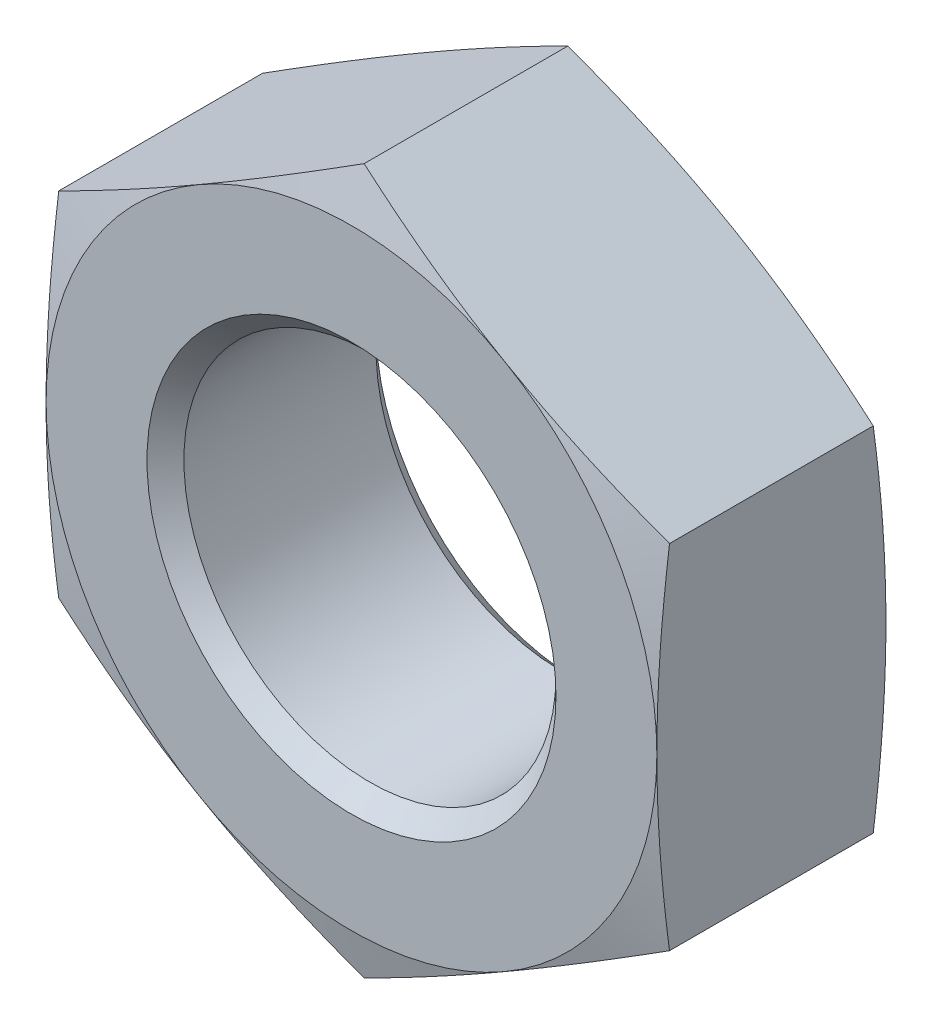
ISO-10303-21;
HEADER;
FILE_DESCRIPTION(('STEP AP214'),'2;1');
FILE_NAME('part.step','',(''),(''),'','','');
FILE_SCHEMA(('AUTOMOTIVE_DESIGN { 1 0 10303 214 1 1 1 1 }'));
ENDSEC;
DATA;
#1=APPLICATION_CONTEXT('core data for automotive mechanical design processes');
#2=APPLICATION_PROTOCOL_DEFINITION('international standard','automotive_design',2000,#1);
#3=PRODUCT_CONTEXT('',#1,'mechanical');
#4=PRODUCT('Part','Part','',(#3));
#5=PRODUCT_RELATED_PRODUCT_CATEGORY('part','',(#4));
#6=PRODUCT_DEFINITION_FORMATION('','',#4);
#7=PRODUCT_DEFINITION_CONTEXT('part definition',#1,'design');
#8=PRODUCT_DEFINITION('design','',#6,#7);
#9=PRODUCT_DEFINITION_SHAPE('','',#8);
#10=(LENGTH_UNIT() NAMED_UNIT(*) SI_UNIT(.MILLI.,.METRE.));
#11=(NAMED_UNIT(*) PLANE_ANGLE_UNIT() SI_UNIT($,.RADIAN.));
#12=(NAMED_UNIT(*) SI_UNIT($,.STERADIAN.) SOLID_ANGLE_UNIT());
#13=UNCERTAINTY_MEASURE_WITH_UNIT(LENGTH_MEASURE(1.E-05),#10,'distance_accuracy_value','');
#14=(GEOMETRIC_REPRESENTATION_CONTEXT(3) GLOBAL_UNCERTAINTY_ASSIGNED_CONTEXT((#13)) GLOBAL_UNIT_ASSIGNED_CONTEXT((#10,
#11,#12)) REPRESENTATION_CONTEXT('',''));
#15=CARTESIAN_POINT('',(0.,0.,0.));
#16=DIRECTION('',(0.,0.,1.));
#17=DIRECTION('',(1.,0.,0.));
#18=AXIS2_PLACEMENT_3D('',#15,#16,#17);
#19=CARTESIAN_POINT('',(0.,0.,0.));
#20=DIRECTION('',(0.,0.,-1.));
#21=DIRECTION('',(-1.,0.,0.));
#22=AXIS2_PLACEMENT_3D('',#19,#20,#21);
#23=PLANE('',#22);
#24=CARTESIAN_POINT('',(0.,0.,0.));
#25=DIRECTION('',(0.,0.,1.));
#26=DIRECTION('',(1.,0.,0.));
#27=AXIS2_PLACEMENT_3D('',#24,#25,#26);
#28=CIRCLE('',#27,14.224);
#29=CARTESIAN_POINT('',(14.224,0.,0.));
#30=VERTEX_POINT('',#29);
#31=CARTESIAN_POINT('',(7.11199999999961,12.3183453434298,0.));
#32=VERTEX_POINT('',#31);
#33=EDGE_CURVE('E11',#30,#32,#28,.T.);
#34=ORIENTED_EDGE('',*,*,#33,.T.);
#35=CARTESIAN_POINT('',(-7.11199999999961,12.3183453434298,0.));
#36=VERTEX_POINT('',#35);
#37=EDGE_CURVE('E45',#32,#36,#28,.T.);
#38=ORIENTED_EDGE('',*,*,#37,.T.);
#39=CARTESIAN_POINT('',(-14.224,0.,0.));
#40=VERTEX_POINT('',#39);
#41=EDGE_CURVE('E330',#36,#40,#28,.T.);
#42=ORIENTED_EDGE('',*,*,#41,.T.);
#43=CARTESIAN_POINT('',(-7.11199999999961,-12.3183453434298,0.));
#44=VERTEX_POINT('',#43);
#45=EDGE_CURVE('E323',#40,#44,#28,.T.);
#46=ORIENTED_EDGE('',*,*,#45,.T.);
#47=CARTESIAN_POINT('',(7.11199999999961,-12.3183453434298,0.));
#48=VERTEX_POINT('',#47);
#49=EDGE_CURVE('E326',#44,#48,#28,.T.);
#50=ORIENTED_EDGE('',*,*,#49,.T.);
#51=EDGE_CURVE('E46',#48,#30,#28,.T.);
#52=ORIENTED_EDGE('',*,*,#51,.T.);
#53=EDGE_LOOP('',(#34,#38,#42,#46,#50,#52));
#54=FACE_BOUND('',#53,.T.);
#55=CARTESIAN_POINT('',(0.,0.,0.));
#56=DIRECTION('',(0.,0.,1.));
#57=DIRECTION('',(1.,0.,0.));
#58=AXIS2_PLACEMENT_3D('',#55,#56,#57);
#59=CIRCLE('',#58,9.525);
#60=CARTESIAN_POINT('',(9.525,0.,0.));
#61=VERTEX_POINT('',#60);
#62=EDGE_CURVE('E187',#61,#61,#59,.T.);
#63=ORIENTED_EDGE('',*,*,#62,.F.);
#64=EDGE_LOOP('',(#63));
#65=FACE_BOUND('',#64,.T.);
#66=ADVANCED_FACE('F38',(#54,#65),#23,.F.);
#67=CARTESIAN_POINT('',(0.,14.224,-10.668));
#68=DIRECTION('',(0.,0.,1.));
#69=DIRECTION('',(1.,0.,0.));
#70=AXIS2_PLACEMENT_3D('',#67,#68,#69);
#71=PLANE('',#70);
#72=CARTESIAN_POINT('',(0.,0.,-10.668));
#73=DIRECTION('',(0.,0.,1.));
#74=DIRECTION('',(1.,0.,0.));
#75=AXIS2_PLACEMENT_3D('',#72,#73,#74);
#76=CIRCLE('',#75,14.224);
#77=CARTESIAN_POINT('',(14.224,0.,-10.668));
#78=VERTEX_POINT('',#77);
#79=CARTESIAN_POINT('',(7.11199999999961,12.3183453434298,-10.668));
#80=VERTEX_POINT('',#79);
#81=EDGE_CURVE('E361',#78,#80,#76,.T.);
#82=ORIENTED_EDGE('',*,*,#81,.F.);
#83=CARTESIAN_POINT('',(7.1119999999996,-12.3183453434298,-10.668));
#84=VERTEX_POINT('',#83);
#85=EDGE_CURVE('E364',#84,#78,#76,.T.);
#86=ORIENTED_EDGE('',*,*,#85,.F.);
#87=CARTESIAN_POINT('',(-7.1119999999996,-12.3183453434298,-10.668));
#88=VERTEX_POINT('',#87);
#89=EDGE_CURVE('E365',#88,#84,#76,.T.);
#90=ORIENTED_EDGE('',*,*,#89,.F.);
#91=CARTESIAN_POINT('',(-14.224,0.,-10.668));
#92=VERTEX_POINT('',#91);
#93=EDGE_CURVE('E145',#92,#88,#76,.T.);
#94=ORIENTED_EDGE('',*,*,#93,.F.);
#95=CARTESIAN_POINT('',(-7.11199999999961,12.3183453434298,-10.668));
#96=VERTEX_POINT('',#95);
#97=EDGE_CURVE('E362',#96,#92,#76,.T.);
#98=ORIENTED_EDGE('',*,*,#97,.F.);
#99=EDGE_CURVE('E358',#80,#96,#76,.T.);
#100=ORIENTED_EDGE('',*,*,#99,.F.);
#101=EDGE_LOOP('',(#82,#86,#90,#94,#98,#100));
#102=FACE_BOUND('',#101,.T.);
#103=CARTESIAN_POINT('',(0.,0.,-10.668));
#104=DIRECTION('',(0.,0.,1.));
#105=DIRECTION('',(1.,0.,0.));
#106=AXIS2_PLACEMENT_3D('',#103,#104,#105);
#107=CIRCLE('',#106,9.525);
#108=CARTESIAN_POINT('',(9.525,0.,-10.668));
#109=VERTEX_POINT('',#108);
#110=EDGE_CURVE('E207',#109,#109,#107,.T.);
#111=ORIENTED_EDGE('',*,*,#110,.T.);
#112=EDGE_LOOP('',(#111));
#113=FACE_BOUND('',#112,.T.);
#114=ADVANCED_FACE('F211',(#102,#113),#71,.F.);
#115=CARTESIAN_POINT('',(0.,0.,-0.76226186262806));
#116=DIRECTION('',(0.,0.,-1.));
#117=DIRECTION('',(-1.,0.,0.));
#118=AXIS2_PLACEMENT_3D('',#115,#116,#117);
#119=CONICAL_SURFACE('',#118,17.0688,1.30899693899575);
#120=CARTESIAN_POINT('',(-14.2242,8.21211475889936,-0.589642543106609));
#121=CARTESIAN_POINT('',(-13.6334964017427,8.55315764036449,-0.498223869578172));
#122=CARTESIAN_POINT('',(-13.0417218233648,8.89481885249051,-0.415230941104795));
#123=CARTESIAN_POINT('',(-11.8560828650969,9.57934782420813,-0.269420318898556));
#124=CARTESIAN_POINT('',(-11.2622177351571,9.92221601684124,-0.206610819128363));
#125=CARTESIAN_POINT('',(-10.0759981081415,10.6070802378167,-0.104833676719914));
#126=CARTESIAN_POINT('',(-9.48365163147777,10.949071635572,-0.0657446660571715));
#127=CARTESIAN_POINT('',(-8.29820332430729,11.6334905348272,-0.0133303197757476));
#128=CARTESIAN_POINT('',(-7.70510166215365,11.9759179391284,0.));
#129=CARTESIAN_POINT('',(-6.51889833784636,12.6607727477308,0.));
#130=CARTESIAN_POINT('',(-5.92579667569271,13.003200152032,-0.0133303197757232));
#131=CARTESIAN_POINT('',(-4.74034836852223,13.6876190512872,-0.0657446660571245));
#132=CARTESIAN_POINT('',(-4.14800189185852,14.0296104490425,-0.104833676719856));
#133=CARTESIAN_POINT('',(-2.96178226484294,14.714474670018,-0.206610819128284));
#134=CARTESIAN_POINT('',(-2.36791713490306,15.0573428626511,-0.269420318898467));
#135=CARTESIAN_POINT('',(-1.1822781766352,15.7418718343687,-0.415230941104688));
#136=CARTESIAN_POINT('',(-0.590503598257328,16.0835330464947,-0.498223869578057));
#137=CARTESIAN_POINT('',(0.00020000000000094,16.4245759279598,-0.589642543106487));
#138=B_SPLINE_CURVE_WITH_KNOTS('',3,(#120,#121,#122,#123,#124,#125,#126,#127,#128,#129,#130,
#131,#132,#133,#134,#135,#136,#137),.UNSPECIFIED.,.F.,.F.,(4,2,2,2,2,2,2,2,4),(0.,
2.06466265366888,4.13016245240679,6.18500281326287,8.23944553461129,10.2938882559597,
12.3487286168158,14.4142284155537,16.4788910692226),.UNSPECIFIED.);
#139=CARTESIAN_POINT('',(-14.224,8.2122302289532,-0.589611602672655));
#140=VERTEX_POINT('',#139);
#141=EDGE_CURVE('E338',#140,#36,#138,.T.);
#142=ORIENTED_EDGE('',*,*,#141,.F.);
#143=CARTESIAN_POINT('',(-14.224,-21.7243807604496,-3.14645413575293));
#144=CARTESIAN_POINT('',(-14.224,-21.0790787612579,-3.00183393647005));
#145=CARTESIAN_POINT('',(-14.224,-20.4333731459328,-2.85898244881792));
#146=CARTESIAN_POINT('',(-14.224,-19.1409564615723,-2.57777160403007));
#147=CARTESIAN_POINT('',(-14.224,-18.4942453503731,-2.43941244090478));
#148=CARTESIAN_POINT('',(-14.224,-17.199040133486,-2.16802054757932));
#149=CARTESIAN_POINT('',(-14.224,-16.5505449010764,-2.03499317547352));
#150=CARTESIAN_POINT('',(-14.224,-15.2522046555058,-1.77570075021796));
#151=CARTESIAN_POINT('',(-14.224,-14.6023596537847,-1.64943563999562));
#152=CARTESIAN_POINT('',(-14.224,-13.3062760588027,-1.40625269348093));
#153=CARTESIAN_POINT('',(-14.224,-12.6600499999559,-1.28926838124654));
#154=CARTESIAN_POINT('',(-14.224,-11.3658185538719,-1.06551002281259));
#155=CARTESIAN_POINT('',(-14.224,-10.7178131600359,-0.958736014531763));
#156=CARTESIAN_POINT('',(-14.224,-9.41992214696963,-0.757807134861831));
#157=CARTESIAN_POINT('',(-14.224,-8.77003679563019,-0.663650548053401));
#158=CARTESIAN_POINT('',(-14.224,-7.468198029404,-0.490729536189705));
#159=CARTESIAN_POINT('',(-14.224,-6.81624461258036,-0.411965125554683));
#160=CARTESIAN_POINT('',(-14.224,-5.50291447073282,-0.272058791497629));
#161=CARTESIAN_POINT('',(-14.224,-4.8415149523263,-0.211127659016756));
#162=CARTESIAN_POINT('',(-14.224,-3.51705314697331,-0.111091250559055));
#163=CARTESIAN_POINT('',(-14.224,-2.85399089851028,-0.0719854740391221));
#164=CARTESIAN_POINT('',(-14.224,-1.52716546567764,-0.0178805842010804));
#165=CARTESIAN_POINT('',(-14.224,-0.863402737208036,-0.0028705159154332));
#166=CARTESIAN_POINT('',(-14.224,0.464218175297371,0.002120109022077));
#167=CARTESIAN_POINT('',(-14.224,1.1280763592504,-0.0078993127495879));
#168=CARTESIAN_POINT('',(-14.224,2.45737110056316,-0.0524042115785588));
#169=CARTESIAN_POINT('',(-14.224,3.1228046242452,-0.0869784855320352));
#170=CARTESIAN_POINT('',(-14.224,4.4521067280568,-0.178619531809773));
#171=CARTESIAN_POINT('',(-14.224,5.11597527321198,-0.235686802105959));
#172=CARTESIAN_POINT('',(-14.224,6.44214183162605,-0.369431212169284));
#173=CARTESIAN_POINT('',(-14.224,7.10443853417782,-0.44612114943521));
#174=CARTESIAN_POINT('',(-14.224,8.42690051036191,-0.615919714969843));
#175=CARTESIAN_POINT('',(-14.224,9.08706577729564,-0.709028394787601));
#176=CARTESIAN_POINT('',(-14.224,10.3616881419258,-0.902075903202118));
#177=CARTESIAN_POINT('',(-14.224,10.9762769243492,-1.00115404522787));
#178=CARTESIAN_POINT('',(-14.224,12.2038347725701,-1.2089269149949));
#179=CARTESIAN_POINT('',(-14.224,12.816803793707,-1.31762190510449));
#180=CARTESIAN_POINT('',(-14.224,14.0413523417607,-1.54287313226601));
#181=CARTESIAN_POINT('',(-14.224,14.6529317224949,-1.65943016007505));
#182=CARTESIAN_POINT('',(-14.224,15.8748232687543,-1.89895612856139));
#183=CARTESIAN_POINT('',(-14.224,16.4851354456942,-2.02192501121958));
#184=CARTESIAN_POINT('',(-14.224,17.7048200333045,-2.27314775295765));
#185=CARTESIAN_POINT('',(-14.224,18.3141921846005,-2.40140286773506));
#186=CARTESIAN_POINT('',(-14.224,19.5320078526129,-2.66224393898536));
#187=CARTESIAN_POINT('',(-14.224,20.1404513678453,-2.79482990237158));
#188=CARTESIAN_POINT('',(-14.224,21.3565052633747,-3.06358133589582));
#189=CARTESIAN_POINT('',(-14.224,21.964115694423,-3.19974657676952));
#190=CARTESIAN_POINT('',(-14.224,23.1786575662446,-3.47507499569198));
#191=CARTESIAN_POINT('',(-14.224,23.7855890052031,-3.61423818173312));
#192=CARTESIAN_POINT('',(-14.224,25.5935865451477,-4.03272204491187));
#193=CARTESIAN_POINT('',(-14.224,26.7938060998848,-4.31569985289214));
#194=CARTESIAN_POINT('',(-14.224,29.1925719627601,-4.88872703273703));
#195=CARTESIAN_POINT('',(-14.224,30.3911182399946,-5.17877653342865));
#196=CARTESIAN_POINT('',(-14.224,32.7854479961846,-5.76376628828304));
#197=CARTESIAN_POINT('',(-14.224,33.9812330593344,-6.05870006542956));
#198=CARTESIAN_POINT('',(-14.224,35.774148367509,-6.50408039658097));
#199=CARTESIAN_POINT('',(-14.224,36.3716501445452,-6.65303469632044));
#200=CARTESIAN_POINT('',(-14.224,37.5664329007948,-6.95182359424588));
#201=CARTESIAN_POINT('',(-14.224,38.1637138802456,-7.10165819148267));
#202=CARTESIAN_POINT('',(-14.224,38.7608985394636,-7.25187587206677));
#203=B_SPLINE_CURVE_WITH_KNOTS('',3,(#143,#144,#145,#146,#147,#148,#149,#150,#151,#152,#153,
#154,#155,#156,#157,#158,#159,#160,#161,#162,#163,#164,#165,#166,#167,#168,#169,#170,#171,#172,
#173,#174,#175,#176,#177,#178,#179,#180,#181,#182,#183,#184,#185,#186,#187,#188,#189,#190,#191,
#192,#193,#194,#195,#196,#197,#198,#199,#200,#201,#202),.UNSPECIFIED.,.F.,.F.,(4,2,2,2,2,2,2,2,
2,2,2,2,2,2,2,2,2,2,2,2,2,2,2,2,2,2,2,2,2,4),(0.,1.98393525298285,3.96795607269393,
5.95392311482308,7.93987339301165,9.90999601510796,11.8801259535033,13.8499877677621,
15.8198514274878,17.8121368736914,19.8043766269071,21.7957103636219,23.7870423837239,
25.7856125017568,27.7842268685726,29.7841480276553,31.7840754658958,33.651556820601,
35.5190891399367,37.3868095749859,39.2545131124777,41.1226628925537,42.9908156549023,
44.8588490462023,46.7268874182071,50.4262355105997,54.1256510454769,57.820501401386,
59.6678671098419,61.515230826727),.UNSPECIFIED.);
#204=EDGE_CURVE('E156',#40,#140,#203,.T.);
#205=ORIENTED_EDGE('',*,*,#204,.F.);
#206=ORIENTED_EDGE('',*,*,#41,.F.);
#207=EDGE_LOOP('',(#142,#205,#206));
#208=FACE_BOUND('',#207,.T.);
#209=ADVANCED_FACE('F229',(#208),#119,.T.);
#210=CARTESIAN_POINT('',(0.,16.424460457906,-0.589611602672533));
#211=VERTEX_POINT('',#210);
#212=EDGE_CURVE('E335',#36,#211,#138,.T.);
#213=ORIENTED_EDGE('',*,*,#212,.F.);
#214=ORIENTED_EDGE('',*,*,#37,.F.);
#215=CARTESIAN_POINT('',(-0.0002,16.4245759279598,-0.589642543106487));
#216=CARTESIAN_POINT('',(0.590503598257331,16.0835330464947,-0.498223869578057));
#217=CARTESIAN_POINT('',(1.1822781766352,15.7418718343687,-0.415230941104688));
#218=CARTESIAN_POINT('',(2.36791713490306,15.0573428626511,-0.269420318898467));
#219=CARTESIAN_POINT('',(2.96178226484294,14.714474670018,-0.206610819128284));
#220=CARTESIAN_POINT('',(4.14800189185852,14.0296104490425,-0.104833676719856));
#221=CARTESIAN_POINT('',(4.74034836852223,13.6876190512872,-0.0657446660571243));
#222=CARTESIAN_POINT('',(5.92579667569271,13.003200152032,-0.0133303197757233));
#223=CARTESIAN_POINT('',(6.51889833784636,12.6607727477308,0.));
#224=CARTESIAN_POINT('',(7.70510166215365,11.9759179391284,0.));
#225=CARTESIAN_POINT('',(8.29820332430729,11.6334905348272,-0.0133303197757474));
#226=CARTESIAN_POINT('',(9.48365163147777,10.949071635572,-0.0657446660571714));
#227=CARTESIAN_POINT('',(10.0759981081415,10.6070802378167,-0.104833676719914));
#228=CARTESIAN_POINT('',(11.2622177351571,9.92221601684124,-0.206610819128363));
#229=CARTESIAN_POINT('',(11.8560828650969,9.57934782420813,-0.269420318898556));
#230=CARTESIAN_POINT('',(13.0417218233648,8.89481885249051,-0.415230941104795));
#231=CARTESIAN_POINT('',(13.6334964017427,8.55315764036449,-0.498223869578172));
#232=CARTESIAN_POINT('',(14.2242,8.21211475889936,-0.589642543106609));
#233=B_SPLINE_CURVE_WITH_KNOTS('',3,(#215,#216,#217,#218,#219,#220,#221,#222,#223,#224,#225,
#226,#227,#228,#229,#230,#231,#232),.UNSPECIFIED.,.F.,.F.,(4,2,2,2,2,2,2,2,4),(0.,
2.06466265366888,4.13016245240679,6.18500281326287,8.2394455346113,10.2938882559597,
12.3487286168158,14.4142284155537,16.4788910692226),.UNSPECIFIED.);
#234=EDGE_CURVE('E268',#211,#32,#233,.T.);
#235=ORIENTED_EDGE('',*,*,#234,.F.);
#236=EDGE_LOOP('',(#213,#214,#235));
#237=FACE_BOUND('',#236,.T.);
#238=ADVANCED_FACE('F277',(#237),#119,.T.);
#239=CARTESIAN_POINT('',(14.224,8.2122302289532,-0.589611602672655));
#240=VERTEX_POINT('',#239);
#241=EDGE_CURVE('E263',#32,#240,#233,.T.);
#242=ORIENTED_EDGE('',*,*,#241,.F.);
#243=ORIENTED_EDGE('',*,*,#33,.F.);
#244=CARTESIAN_POINT('',(14.224,-21.7243807604496,-3.14645413575293));
#245=CARTESIAN_POINT('',(14.224,-21.0790787612579,-3.00183393647005));
#246=CARTESIAN_POINT('',(14.224,-20.4333731459328,-2.85898244881792));
#247=CARTESIAN_POINT('',(14.224,-19.1409564615723,-2.57777160403007));
#248=CARTESIAN_POINT('',(14.224,-18.4942453503731,-2.43941244090478));
#249=CARTESIAN_POINT('',(14.224,-17.199040133486,-2.16802054757932));
#250=CARTESIAN_POINT('',(14.224,-16.5505449010764,-2.03499317547352));
#251=CARTESIAN_POINT('',(14.224,-15.2522046555058,-1.77570075021796));
#252=CARTESIAN_POINT('',(14.224,-14.6023596537847,-1.64943563999562));
#253=CARTESIAN_POINT('',(14.224,-13.3062760588027,-1.40625269348093));
#254=CARTESIAN_POINT('',(14.224,-12.6600499999559,-1.28926838124654));
#255=CARTESIAN_POINT('',(14.224,-11.3658185538719,-1.06551002281259));
#256=CARTESIAN_POINT('',(14.224,-10.7178131600359,-0.958736014531763));
#257=CARTESIAN_POINT('',(14.224,-9.41992214696963,-0.757807134861831));
#258=CARTESIAN_POINT('',(14.224,-8.77003679563019,-0.663650548053401));
#259=CARTESIAN_POINT('',(14.224,-7.468198029404,-0.490729536189705));
#260=CARTESIAN_POINT('',(14.224,-6.81624461258036,-0.411965125554683));
#261=CARTESIAN_POINT('',(14.224,-5.50291447073282,-0.272058791497629));
#262=CARTESIAN_POINT('',(14.224,-4.8415149523263,-0.211127659016756));
#263=CARTESIAN_POINT('',(14.224,-3.51705314697331,-0.111091250559055));
#264=CARTESIAN_POINT('',(14.224,-2.85399089851028,-0.0719854740391221));
#265=CARTESIAN_POINT('',(14.224,-1.52716546567764,-0.0178805842010804));
#266=CARTESIAN_POINT('',(14.224,-0.863402737208036,-0.0028705159154332));
#267=CARTESIAN_POINT('',(14.224,0.464218175297371,0.002120109022077));
#268=CARTESIAN_POINT('',(14.224,1.1280763592504,-0.0078993127495879));
#269=CARTESIAN_POINT('',(14.224,2.45737110056316,-0.0524042115785588));
#270=CARTESIAN_POINT('',(14.224,3.1228046242452,-0.0869784855320352));
#271=CARTESIAN_POINT('',(14.224,4.4521067280568,-0.178619531809773));
#272=CARTESIAN_POINT('',(14.224,5.11597527321198,-0.235686802105959));
#273=CARTESIAN_POINT('',(14.224,6.44214183162605,-0.369431212169284));
#274=CARTESIAN_POINT('',(14.224,7.10443853417782,-0.44612114943521));
#275=CARTESIAN_POINT('',(14.224,8.42690051036191,-0.615919714969843));
#276=CARTESIAN_POINT('',(14.224,9.08706577729564,-0.709028394787601));
#277=CARTESIAN_POINT('',(14.224,10.3616881419258,-0.902075903202118));
#278=CARTESIAN_POINT('',(14.224,10.9762769243492,-1.00115404522787));
#279=CARTESIAN_POINT('',(14.224,12.2038347725701,-1.2089269149949));
#280=CARTESIAN_POINT('',(14.224,12.816803793707,-1.31762190510449));
#281=CARTESIAN_POINT('',(14.224,14.0413523417607,-1.54287313226601));
#282=CARTESIAN_POINT('',(14.224,14.6529317224949,-1.65943016007505));
#283=CARTESIAN_POINT('',(14.224,15.8748232687543,-1.89895612856139));
#284=CARTESIAN_POINT('',(14.224,16.4851354456942,-2.02192501121958));
#285=CARTESIAN_POINT('',(14.224,17.7048200333045,-2.27314775295765));
#286=CARTESIAN_POINT('',(14.224,18.3141921846005,-2.40140286773506));
#287=CARTESIAN_POINT('',(14.224,19.5320078526129,-2.66224393898536));
#288=CARTESIAN_POINT('',(14.224,20.1404513678453,-2.79482990237158));
#289=CARTESIAN_POINT('',(14.224,21.3565052633747,-3.06358133589582));
#290=CARTESIAN_POINT('',(14.224,21.964115694423,-3.19974657676952));
#291=CARTESIAN_POINT('',(14.224,23.1786575662446,-3.47507499569198));
#292=CARTESIAN_POINT('',(14.224,23.7855890052031,-3.61423818173312));
#293=CARTESIAN_POINT('',(14.224,25.5935865451477,-4.03272204491187));
#294=CARTESIAN_POINT('',(14.224,26.7938060998848,-4.31569985289214));
#295=CARTESIAN_POINT('',(14.224,29.1925719627601,-4.88872703273703));
#296=CARTESIAN_POINT('',(14.224,30.3911182399946,-5.17877653342865));
#297=CARTESIAN_POINT('',(14.224,32.7854479961846,-5.76376628828304));
#298=CARTESIAN_POINT('',(14.224,33.9812330593344,-6.05870006542956));
#299=CARTESIAN_POINT('',(14.224,35.774148367509,-6.50408039658097));
#300=CARTESIAN_POINT('',(14.224,36.3716501445452,-6.65303469632044));
#301=CARTESIAN_POINT('',(14.224,37.5664329007948,-6.95182359424588));
#302=CARTESIAN_POINT('',(14.224,38.1637138802456,-7.10165819148267));
#303=CARTESIAN_POINT('',(14.224,38.7608985394636,-7.25187587206677));
#304=B_SPLINE_CURVE_WITH_KNOTS('',3,(#244,#245,#246,#247,#248,#249,#250,#251,#252,#253,#254,
#255,#256,#257,#258,#259,#260,#261,#262,#263,#264,#265,#266,#267,#268,#269,#270,#271,#272,#273,
#274,#275,#276,#277,#278,#279,#280,#281,#282,#283,#284,#285,#286,#287,#288,#289,#290,#291,#292,
#293,#294,#295,#296,#297,#298,#299,#300,#301,#302,#303),.UNSPECIFIED.,.F.,.F.,(4,2,2,2,2,2,2,2,
2,2,2,2,2,2,2,2,2,2,2,2,2,2,2,2,2,2,2,2,2,4),(0.,1.98393525298285,3.96795607269393,
5.95392311482308,7.93987339301165,9.90999601510796,11.8801259535033,13.8499877677621,
15.8198514274878,17.8121368736914,19.8043766269071,21.7957103636219,23.7870423837239,
25.7856125017568,27.7842268685726,29.7841480276553,31.7840754658958,33.651556820601,
35.5190891399367,37.3868095749859,39.2545131124777,41.1226628925537,42.9908156549023,
44.8588490462023,46.7268874182071,50.4262355105997,54.1256510454769,57.820501401386,
59.6678671098419,61.515230826727),.UNSPECIFIED.);
#305=EDGE_CURVE('E295',#240,#30,#304,.F.);
#306=ORIENTED_EDGE('',*,*,#305,.F.);
#307=EDGE_LOOP('',(#242,#243,#306));
#308=FACE_BOUND('',#307,.T.);
#309=ADVANCED_FACE('F349',(#308),#119,.T.);
#310=CARTESIAN_POINT('',(14.224,-8.2122302289532,-0.589611602672655));
#311=VERTEX_POINT('',#310);
#312=EDGE_CURVE('E291',#30,#311,#304,.F.);
#313=ORIENTED_EDGE('',*,*,#312,.F.);
#314=ORIENTED_EDGE('',*,*,#51,.F.);
#315=CARTESIAN_POINT('',(14.2242,-8.21211475889936,-0.589642543106609));
#316=CARTESIAN_POINT('',(13.6334964017427,-8.55315764036449,-0.498223869578172));
#317=CARTESIAN_POINT('',(13.0417218233648,-8.89481885249051,-0.415230941104795));
#318=CARTESIAN_POINT('',(11.8560828650969,-9.57934782420813,-0.269420318898556));
#319=CARTESIAN_POINT('',(11.2622177351571,-9.92221601684124,-0.206610819128363));
#320=CARTESIAN_POINT('',(10.0759981081415,-10.6070802378167,-0.104833676719914));
#321=CARTESIAN_POINT('',(9.48365163147777,-10.949071635572,-0.0657446660571715));
#322=CARTESIAN_POINT('',(8.29820332430729,-11.6334905348272,-0.0133303197757476));
#323=CARTESIAN_POINT('',(7.70510166215365,-11.9759179391284,0.));
#324=CARTESIAN_POINT('',(6.51889833784636,-12.6607727477308,0.));
#325=CARTESIAN_POINT('',(5.92579667569271,-13.003200152032,-0.0133303197757232));
#326=CARTESIAN_POINT('',(4.74034836852223,-13.6876190512872,-0.0657446660571245));
#327=CARTESIAN_POINT('',(4.14800189185852,-14.0296104490425,-0.104833676719856));
#328=CARTESIAN_POINT('',(2.96178226484294,-14.714474670018,-0.206610819128284));
#329=CARTESIAN_POINT('',(2.36791713490306,-15.0573428626511,-0.269420318898467));
#330=CARTESIAN_POINT('',(1.1822781766352,-15.7418718343687,-0.415230941104688));
#331=CARTESIAN_POINT('',(0.590503598257328,-16.0835330464947,-0.498223869578057));
#332=CARTESIAN_POINT('',(-0.00020000000000094,-16.4245759279598,-0.589642543106487));
#333=B_SPLINE_CURVE_WITH_KNOTS('',3,(#315,#316,#317,#318,#319,#320,#321,#322,#323,#324,#325,
#326,#327,#328,#329,#330,#331,#332),.UNSPECIFIED.,.F.,.F.,(4,2,2,2,2,2,2,2,4),(0.,
2.06466265366888,4.13016245240679,6.18500281326287,8.23944553461129,10.2938882559597,
12.3487286168158,14.4142284155537,16.4788910692226),.UNSPECIFIED.);
#334=EDGE_CURVE('E301',#311,#48,#333,.T.);
#335=ORIENTED_EDGE('',*,*,#334,.F.);
#336=EDGE_LOOP('',(#313,#314,#335));
#337=FACE_BOUND('',#336,.T.);
#338=ADVANCED_FACE('F389',(#337),#119,.T.);
#339=CARTESIAN_POINT('',(0.,-16.424460457906,-0.589611602672533));
#340=VERTEX_POINT('',#339);
#341=EDGE_CURVE('E286',#48,#340,#333,.T.);
#342=ORIENTED_EDGE('',*,*,#341,.F.);
#343=ORIENTED_EDGE('',*,*,#49,.F.);
#344=CARTESIAN_POINT('',(0.0002,-16.4245759279598,-0.589642543106487));
#345=CARTESIAN_POINT('',(-0.590503598257331,-16.0835330464947,-0.498223869578057));
#346=CARTESIAN_POINT('',(-1.1822781766352,-15.7418718343687,-0.415230941104688));
#347=CARTESIAN_POINT('',(-2.36791713490306,-15.0573428626511,-0.269420318898467));
#348=CARTESIAN_POINT('',(-2.96178226484294,-14.714474670018,-0.206610819128284));
#349=CARTESIAN_POINT('',(-4.14800189185852,-14.0296104490425,-0.104833676719856));
#350=CARTESIAN_POINT('',(-4.74034836852223,-13.6876190512872,-0.0657446660571243));
#351=CARTESIAN_POINT('',(-5.92579667569271,-13.003200152032,-0.0133303197757233));
#352=CARTESIAN_POINT('',(-6.51889833784636,-12.6607727477308,0.));
#353=CARTESIAN_POINT('',(-7.70510166215365,-11.9759179391284,0.));
#354=CARTESIAN_POINT('',(-8.29820332430729,-11.6334905348272,-0.0133303197757474));
#355=CARTESIAN_POINT('',(-9.48365163147777,-10.949071635572,-0.0657446660571714));
#356=CARTESIAN_POINT('',(-10.0759981081415,-10.6070802378167,-0.104833676719914));
#357=CARTESIAN_POINT('',(-11.2622177351571,-9.92221601684124,-0.206610819128363));
#358=CARTESIAN_POINT('',(-11.8560828650969,-9.57934782420813,-0.269420318898556));
#359=CARTESIAN_POINT('',(-13.0417218233648,-8.89481885249051,-0.415230941104795));
#360=CARTESIAN_POINT('',(-13.6334964017427,-8.55315764036449,-0.498223869578172));
#361=CARTESIAN_POINT('',(-14.2242,-8.21211475889936,-0.589642543106609));
#362=B_SPLINE_CURVE_WITH_KNOTS('',3,(#344,#345,#346,#347,#348,#349,#350,#351,#352,#353,#354,
#355,#356,#357,#358,#359,#360,#361),.UNSPECIFIED.,.F.,.F.,(4,2,2,2,2,2,2,2,4),(0.,
2.06466265366888,4.13016245240679,6.18500281326287,8.2394455346113,10.2938882559597,
12.3487286168158,14.4142284155537,16.4788910692226),.UNSPECIFIED.);
#363=EDGE_CURVE('E148',#340,#44,#362,.T.);
#364=ORIENTED_EDGE('',*,*,#363,.F.);
#365=EDGE_LOOP('',(#342,#343,#364));
#366=FACE_BOUND('',#365,.T.);
#367=ADVANCED_FACE('F327',(#366),#119,.T.);
#368=CARTESIAN_POINT('',(-14.224,-8.2122302289532,-0.589611602672655));
#369=VERTEX_POINT('',#368);
#370=EDGE_CURVE('E140',#44,#369,#362,.T.);
#371=ORIENTED_EDGE('',*,*,#370,.F.);
#372=ORIENTED_EDGE('',*,*,#45,.F.);
#373=EDGE_CURVE('E53',#369,#40,#203,.T.);
#374=ORIENTED_EDGE('',*,*,#373,.F.);
#375=EDGE_LOOP('',(#371,#372,#374));
#376=FACE_BOUND('',#375,.T.);
#377=ADVANCED_FACE('F279',(#376),#119,.T.);
#378=CARTESIAN_POINT('',(0.,16.424460457906,-10.668));
#379=DIRECTION('',(-0.49999999999998,0.86602540378445,0.));
#380=DIRECTION('',(-0.86602540378445,-0.49999999999998,0.));
#381=AXIS2_PLACEMENT_3D('',#378,#379,#380);
#382=PLANE('',#381);
#383=ORIENTED_EDGE('',*,*,#141,.T.);
#384=ORIENTED_EDGE('',*,*,#212,.T.);
#385=DIRECTION('',(0.,0.,1.));
#386=VECTOR('',#385,1.);
#387=CARTESIAN_POINT('',(0.,16.424460457906,-10.668));
#388=LINE('',#387,#386);
#389=CARTESIAN_POINT('',(0.,16.424460457906,-10.0783883973274));
#390=VERTEX_POINT('',#389);
#391=EDGE_CURVE('E133',#390,#211,#388,.T.);
#392=ORIENTED_EDGE('',*,*,#391,.F.);
#393=CARTESIAN_POINT('',(0.000200000000000137,16.4245759279598,-10.0783574568935));
#394=CARTESIAN_POINT('',(-0.59050359825733,16.0835330464947,-10.1697761304219));
#395=CARTESIAN_POINT('',(-1.1822781766352,15.7418718343687,-10.2527690588953));
#396=CARTESIAN_POINT('',(-2.36791713490306,15.0573428626511,-10.3985796811015));
#397=CARTESIAN_POINT('',(-2.96178226484294,14.714474670018,-10.4613891808717));
#398=CARTESIAN_POINT('',(-4.14800189185852,14.0296104490425,-10.5631663232801));
#399=CARTESIAN_POINT('',(-4.74034836852223,13.6876190512872,-10.6022553339429));
#400=CARTESIAN_POINT('',(-5.92579667569271,13.003200152032,-10.6546696802243));
#401=CARTESIAN_POINT('',(-6.51889833784636,12.6607727477308,-10.6680000000001));
#402=CARTESIAN_POINT('',(-7.70510166215365,11.9759179391284,-10.6680000000001));
#403=CARTESIAN_POINT('',(-8.29820332430729,11.6334905348272,-10.6546696802243));
#404=CARTESIAN_POINT('',(-9.48365163147777,10.949071635572,-10.6022553339428));
#405=CARTESIAN_POINT('',(-10.0759981081415,10.6070802378167,-10.5631663232801));
#406=CARTESIAN_POINT('',(-11.2622177351571,9.92221601684124,-10.4613891808716));
#407=CARTESIAN_POINT('',(-11.8560828650969,9.57934782420813,-10.3985796811014));
#408=CARTESIAN_POINT('',(-13.0417218233648,8.89481885249051,-10.2527690588952));
#409=CARTESIAN_POINT('',(-13.6334964017427,8.55315764036449,-10.1697761304218));
#410=CARTESIAN_POINT('',(-14.2242,8.21211475889936,-10.0783574568934));
#411=B_SPLINE_CURVE_WITH_KNOTS('',3,(#393,#394,#395,#396,#397,#398,#399,#400,#401,#402,#403,
#404,#405,#406,#407,#408,#409,#410),.UNSPECIFIED.,.F.,.F.,(4,2,2,2,2,2,2,2,4),(0.,
2.06466265366888,4.13016245240679,6.18500281326288,8.2394455346113,10.2938882559597,
12.3487286168158,14.4142284155537,16.4788910692226),.UNSPECIFIED.);
#412=EDGE_CURVE('E339',#390,#96,#411,.T.);
#413=ORIENTED_EDGE('',*,*,#412,.T.);
#414=CARTESIAN_POINT('',(-14.224,8.2122302289532,-10.0783883973273));
#415=VERTEX_POINT('',#414);
#416=EDGE_CURVE('E270',#96,#415,#411,.T.);
#417=ORIENTED_EDGE('',*,*,#416,.T.);
#418=DIRECTION('',(0.,0.,1.));
#419=VECTOR('',#418,1.);
#420=CARTESIAN_POINT('',(-14.224,8.2122302289532,-10.668));
#421=LINE('',#420,#419);
#422=EDGE_CURVE('E142',#415,#140,#421,.T.);
#423=ORIENTED_EDGE('',*,*,#422,.T.);
#424=EDGE_LOOP('',(#383,#384,#392,#413,#417,#423));
#425=FACE_BOUND('',#424,.T.);
#426=ADVANCED_FACE('F179',(#425),#382,.T.);
#427=CARTESIAN_POINT('',(14.224,8.2122302289532,-10.668));
#428=DIRECTION('',(0.49999999999998,0.86602540378445,0.));
#429=DIRECTION('',(-0.86602540378445,0.49999999999998,0.));
#430=AXIS2_PLACEMENT_3D('',#427,#428,#429);
#431=PLANE('',#430);
#432=ORIENTED_EDGE('',*,*,#234,.T.);
#433=ORIENTED_EDGE('',*,*,#241,.T.);
#434=DIRECTION('',(0.,0.,1.));
#435=VECTOR('',#434,1.);
#436=CARTESIAN_POINT('',(14.224,8.2122302289532,-10.668));
#437=LINE('',#436,#435);
#438=CARTESIAN_POINT('',(14.224,8.2122302289532,-10.0783883973273));
#439=VERTEX_POINT('',#438);
#440=EDGE_CURVE('E194',#439,#240,#437,.T.);
#441=ORIENTED_EDGE('',*,*,#440,.F.);
#442=CARTESIAN_POINT('',(14.2242,8.21211475889936,-10.0783574568934));
#443=CARTESIAN_POINT('',(13.6334964017427,8.55315764036449,-10.1697761304218));
#444=CARTESIAN_POINT('',(13.0417218233648,8.89481885249051,-10.2527690588952));
#445=CARTESIAN_POINT('',(11.8560828650969,9.57934782420813,-10.3985796811014));
#446=CARTESIAN_POINT('',(11.2622177351571,9.92221601684124,-10.4613891808716));
#447=CARTESIAN_POINT('',(10.0759981081415,10.6070802378167,-10.5631663232801));
#448=CARTESIAN_POINT('',(9.48365163147777,10.949071635572,-10.6022553339428));
#449=CARTESIAN_POINT('',(8.29820332430729,11.6334905348272,-10.6546696802243));
#450=CARTESIAN_POINT('',(7.70510166215365,11.9759179391284,-10.6680000000001));
#451=CARTESIAN_POINT('',(6.51889833784636,12.6607727477308,-10.6680000000001));
#452=CARTESIAN_POINT('',(5.92579667569271,13.003200152032,-10.6546696802243));
#453=CARTESIAN_POINT('',(4.74034836852223,13.6876190512872,-10.6022553339429));
#454=CARTESIAN_POINT('',(4.14800189185852,14.0296104490425,-10.5631663232801));
#455=CARTESIAN_POINT('',(2.96178226484294,14.714474670018,-10.4613891808717));
#456=CARTESIAN_POINT('',(2.36791713490306,15.0573428626511,-10.3985796811015));
#457=CARTESIAN_POINT('',(1.1822781766352,15.7418718343687,-10.2527690588953));
#458=CARTESIAN_POINT('',(0.590503598257328,16.0835330464947,-10.1697761304219));
#459=CARTESIAN_POINT('',(-0.000200000000001894,16.4245759279598,-10.0783574568935));
#460=B_SPLINE_CURVE_WITH_KNOTS('',3,(#442,#443,#444,#445,#446,#447,#448,#449,#450,#451,#452,
#453,#454,#455,#456,#457,#458,#459),.UNSPECIFIED.,.F.,.F.,(4,2,2,2,2,2,2,2,4),(0.,
2.06466265366888,4.13016245240679,6.18500281326287,8.2394455346113,10.2938882559597,
12.3487286168158,14.4142284155537,16.4788910692226),.UNSPECIFIED.);
#461=EDGE_CURVE('E269',#439,#80,#460,.T.);
#462=ORIENTED_EDGE('',*,*,#461,.T.);
#463=EDGE_CURVE('E257',#80,#390,#460,.T.);
#464=ORIENTED_EDGE('',*,*,#463,.T.);
#465=ORIENTED_EDGE('',*,*,#391,.T.);
#466=EDGE_LOOP('',(#432,#433,#441,#462,#464,#465));
#467=FACE_BOUND('',#466,.T.);
#468=ADVANCED_FACE('F249',(#467),#431,.T.);
#469=CARTESIAN_POINT('',(14.224,-8.2122302289532,-10.668));
#470=DIRECTION('',(1.,0.,0.));
#471=DIRECTION('',(0.,0.,-1.));
#472=AXIS2_PLACEMENT_3D('',#469,#470,#471);
#473=PLANE('',#472);
#474=ORIENTED_EDGE('',*,*,#305,.T.);
#475=ORIENTED_EDGE('',*,*,#312,.T.);
#476=DIRECTION('',(0.,0.,1.));
#477=VECTOR('',#476,1.);
#478=CARTESIAN_POINT('',(14.224,-8.2122302289532,-10.668));
#479=LINE('',#478,#477);
#480=CARTESIAN_POINT('',(14.224,-8.2122302289532,-10.0783883973273));
#481=VERTEX_POINT('',#480);
#482=EDGE_CURVE('E191',#481,#311,#479,.T.);
#483=ORIENTED_EDGE('',*,*,#482,.F.);
#484=CARTESIAN_POINT('',(14.224,-21.7243807604496,-7.5215458642469));
#485=CARTESIAN_POINT('',(14.224,-21.079078761258,-7.6661660635298));
#486=CARTESIAN_POINT('',(14.224,-20.4333731459328,-7.80901755118194));
#487=CARTESIAN_POINT('',(14.224,-19.1409564615723,-8.09022839596979));
#488=CARTESIAN_POINT('',(14.224,-18.4942453503731,-8.22858755909509));
#489=CARTESIAN_POINT('',(14.224,-17.199040133486,-8.49997945242056));
#490=CARTESIAN_POINT('',(14.224,-16.5505449010764,-8.63300682452638));
#491=CARTESIAN_POINT('',(14.224,-15.2522046555058,-8.89229924978195));
#492=CARTESIAN_POINT('',(14.224,-14.6023596537847,-9.01856436000429));
#493=CARTESIAN_POINT('',(14.224,-13.3062760588027,-9.26174730651899));
#494=CARTESIAN_POINT('',(14.224,-12.6600499999559,-9.37873161875339));
#495=CARTESIAN_POINT('',(14.224,-11.3658185538719,-9.60248997718735));
#496=CARTESIAN_POINT('',(14.224,-10.7178131600359,-9.70926398546819));
#497=CARTESIAN_POINT('',(14.224,-9.41992214696964,-9.91019286513813));
#498=CARTESIAN_POINT('',(14.224,-8.7700367956302,-10.0043494519466));
#499=CARTESIAN_POINT('',(14.224,-7.46819802940401,-10.1772704638103));
#500=CARTESIAN_POINT('',(14.224,-6.81624461258036,-10.2560348744453));
#501=CARTESIAN_POINT('',(14.224,-5.50291447073282,-10.3959412085024));
#502=CARTESIAN_POINT('',(14.224,-4.84151495232629,-10.4568723409832));
#503=CARTESIAN_POINT('',(14.224,-3.5170531469733,-10.5569087494409));
#504=CARTESIAN_POINT('',(14.224,-2.85399089851027,-10.5960145259609));
#505=CARTESIAN_POINT('',(14.224,-1.52716546567762,-10.6501194157989));
#506=CARTESIAN_POINT('',(14.224,-0.863402737208021,-10.6651294840846));
#507=CARTESIAN_POINT('',(14.224,0.464218175297389,-10.6701201090221));
#508=CARTESIAN_POINT('',(14.224,1.12807635925042,-10.6601006872504));
#509=CARTESIAN_POINT('',(14.224,2.45737110056318,-10.6155957884214));
#510=CARTESIAN_POINT('',(14.224,3.12280462424523,-10.581021514468));
#511=CARTESIAN_POINT('',(14.224,4.45210672805683,-10.4893804681902));
#512=CARTESIAN_POINT('',(14.224,5.115975273212,-10.432313197894));
#513=CARTESIAN_POINT('',(14.224,6.44214183162608,-10.2985687878307));
#514=CARTESIAN_POINT('',(14.224,7.10443853417785,-10.2218788505648));
#515=CARTESIAN_POINT('',(14.224,8.42690051036194,-10.0520802850301));
#516=CARTESIAN_POINT('',(14.224,9.08706577729567,-9.95897160521236));
#517=CARTESIAN_POINT('',(14.224,10.3616881419259,-9.76592409679783));
#518=CARTESIAN_POINT('',(14.224,10.9762769243492,-9.66684595477208));
#519=CARTESIAN_POINT('',(14.224,12.2038347725702,-9.45907308500503));
#520=CARTESIAN_POINT('',(14.224,12.8168037937071,-9.35037809489544));
#521=CARTESIAN_POINT('',(14.224,14.0413523417608,-9.1251268677339));
#522=CARTESIAN_POINT('',(14.224,14.6529317224949,-9.00856983992486));
#523=CARTESIAN_POINT('',(14.224,15.8748232687544,-8.76904387143851));
#524=CARTESIAN_POINT('',(14.224,16.4851354456943,-8.64607498878031));
#525=CARTESIAN_POINT('',(14.224,17.7048200333046,-8.39485224704223));
#526=CARTESIAN_POINT('',(14.224,18.3141921846006,-8.26659713226481));
#527=CARTESIAN_POINT('',(14.224,19.5320078526129,-8.0057560610145));
#528=CARTESIAN_POINT('',(14.224,20.1404513678453,-7.87317009762827));
#529=CARTESIAN_POINT('',(14.224,21.3565052633747,-7.60441866410402));
#530=CARTESIAN_POINT('',(14.224,21.964115694423,-7.46825342323031));
#531=CARTESIAN_POINT('',(14.224,23.1786575662446,-7.19292500430784));
#532=CARTESIAN_POINT('',(14.224,23.7855890052032,-7.0537618182667));
#533=CARTESIAN_POINT('',(14.224,25.5935865451478,-6.63527795508793));
#534=CARTESIAN_POINT('',(14.224,26.7938060998848,-6.35230014710764));
#535=CARTESIAN_POINT('',(14.224,29.1925719627601,-5.77927296726272));
#536=CARTESIAN_POINT('',(14.224,30.3911182399946,-5.48922346657109));
#537=CARTESIAN_POINT('',(14.224,32.7854479961846,-4.90423371171667));
#538=CARTESIAN_POINT('',(14.224,33.9812330593344,-4.60929993457014));
#539=CARTESIAN_POINT('',(14.224,35.774148367509,-4.1639196034187));
#540=CARTESIAN_POINT('',(14.224,36.3716501445452,-4.01496530367923));
#541=CARTESIAN_POINT('',(14.224,37.5664329007948,-3.71617640575377));
#542=CARTESIAN_POINT('',(14.224,38.1637138802456,-3.56634180851697));
#543=CARTESIAN_POINT('',(14.224,38.7608985394636,-3.41612412793287));
#544=B_SPLINE_CURVE_WITH_KNOTS('',3,(#484,#485,#486,#487,#488,#489,#490,#491,#492,#493,#494,
#495,#496,#497,#498,#499,#500,#501,#502,#503,#504,#505,#506,#507,#508,#509,#510,#511,#512,#513,
#514,#515,#516,#517,#518,#519,#520,#521,#522,#523,#524,#525,#526,#527,#528,#529,#530,#531,#532,
#533,#534,#535,#536,#537,#538,#539,#540,#541,#542,#543),.UNSPECIFIED.,.F.,.F.,(4,2,2,2,2,2,2,2,
2,2,2,2,2,2,2,2,2,2,2,2,2,2,2,2,2,2,2,2,2,4),(0.,1.98393525298285,3.96795607269394,
5.9539231148231,7.93987339301167,9.90999601510798,11.8801259535033,13.8499877677621,
15.8198514274879,17.8121368736914,19.8043766269072,21.795710363622,23.787042383724,
25.7856125017569,27.7842268685727,29.7841480276554,31.7840754658959,33.6515568206011,
35.5190891399368,37.386809574986,39.2545131124777,41.1226628925538,42.9908156549024,
44.8588490462024,46.7268874182072,50.4262355105998,54.125651045477,57.8205014013861,
59.667867109842,61.5152308267271),.UNSPECIFIED.);
#545=EDGE_CURVE('E296',#481,#78,#544,.T.);
#546=ORIENTED_EDGE('',*,*,#545,.T.);
#547=EDGE_CURVE('E297',#78,#439,#544,.T.);
#548=ORIENTED_EDGE('',*,*,#547,.T.);
#549=ORIENTED_EDGE('',*,*,#440,.T.);
#550=EDGE_LOOP('',(#474,#475,#483,#546,#548,#549));
#551=FACE_BOUND('',#550,.T.);
#552=ADVANCED_FACE('F252',(#551),#473,.T.);
#553=CARTESIAN_POINT('',(0.,-16.424460457906,-10.668));
#554=DIRECTION('',(0.49999999999998,-0.86602540378445,0.));
#555=DIRECTION('',(0.86602540378445,0.49999999999998,0.));
#556=AXIS2_PLACEMENT_3D('',#553,#554,#555);
#557=PLANE('',#556);
#558=ORIENTED_EDGE('',*,*,#334,.T.);
#559=ORIENTED_EDGE('',*,*,#341,.T.);
#560=DIRECTION('',(0.,0.,1.));
#561=VECTOR('',#560,1.);
#562=CARTESIAN_POINT('',(0.,-16.424460457906,-10.668));
#563=LINE('',#562,#561);
#564=CARTESIAN_POINT('',(0.,-16.424460457906,-10.0783883973274));
#565=VERTEX_POINT('',#564);
#566=EDGE_CURVE('E141',#565,#340,#563,.T.);
#567=ORIENTED_EDGE('',*,*,#566,.F.);
#568=CARTESIAN_POINT('',(-0.000200000000000137,-16.4245759279598,-10.0783574568935));
#569=CARTESIAN_POINT('',(0.59050359825733,-16.0835330464947,-10.1697761304219));
#570=CARTESIAN_POINT('',(1.1822781766352,-15.7418718343687,-10.2527690588953));
#571=CARTESIAN_POINT('',(2.36791713490306,-15.0573428626511,-10.3985796811015));
#572=CARTESIAN_POINT('',(2.96178226484294,-14.714474670018,-10.4613891808717));
#573=CARTESIAN_POINT('',(4.14800189185852,-14.0296104490425,-10.5631663232801));
#574=CARTESIAN_POINT('',(4.74034836852223,-13.6876190512872,-10.6022553339429));
#575=CARTESIAN_POINT('',(5.92579667569271,-13.003200152032,-10.6546696802243));
#576=CARTESIAN_POINT('',(6.51889833784636,-12.6607727477308,-10.6680000000001));
#577=CARTESIAN_POINT('',(7.70510166215365,-11.9759179391284,-10.6680000000001));
#578=CARTESIAN_POINT('',(8.29820332430729,-11.6334905348272,-10.6546696802243));
#579=CARTESIAN_POINT('',(9.48365163147777,-10.949071635572,-10.6022553339428));
#580=CARTESIAN_POINT('',(10.0759981081415,-10.6070802378167,-10.5631663232801));
#581=CARTESIAN_POINT('',(11.2622177351571,-9.92221601684124,-10.4613891808716));
#582=CARTESIAN_POINT('',(11.8560828650969,-9.57934782420813,-10.3985796811014));
#583=CARTESIAN_POINT('',(13.0417218233648,-8.89481885249051,-10.2527690588952));
#584=CARTESIAN_POINT('',(13.6334964017427,-8.55315764036449,-10.1697761304218));
#585=CARTESIAN_POINT('',(14.2242,-8.21211475889936,-10.0783574568934));
#586=B_SPLINE_CURVE_WITH_KNOTS('',3,(#568,#569,#570,#571,#572,#573,#574,#575,#576,#577,#578,
#579,#580,#581,#582,#583,#584,#585),.UNSPECIFIED.,.F.,.F.,(4,2,2,2,2,2,2,2,4),(0.,
2.06466265366888,4.13016245240679,6.18500281326288,8.2394455346113,10.2938882559597,
12.3487286168158,14.4142284155537,16.4788910692226),.UNSPECIFIED.);
#587=EDGE_CURVE('E308',#565,#84,#586,.T.);
#588=ORIENTED_EDGE('',*,*,#587,.T.);
#589=EDGE_CURVE('E310',#84,#481,#586,.T.);
#590=ORIENTED_EDGE('',*,*,#589,.T.);
#591=ORIENTED_EDGE('',*,*,#482,.T.);
#592=EDGE_LOOP('',(#558,#559,#567,#588,#590,#591));
#593=FACE_BOUND('',#592,.T.);
#594=ADVANCED_FACE('F171',(#593),#557,.T.);
#595=CARTESIAN_POINT('',(-14.224,-8.2122302289532,-10.668));
#596=DIRECTION('',(-0.49999999999998,-0.86602540378445,0.));
#597=DIRECTION('',(0.86602540378445,-0.49999999999998,0.));
#598=AXIS2_PLACEMENT_3D('',#595,#596,#597);
#599=PLANE('',#598);
#600=ORIENTED_EDGE('',*,*,#363,.T.);
#601=ORIENTED_EDGE('',*,*,#370,.T.);
#602=DIRECTION('',(0.,0.,1.));
#603=VECTOR('',#602,1.);
#604=CARTESIAN_POINT('',(-14.224,-8.2122302289532,-10.668));
#605=LINE('',#604,#603);
#606=CARTESIAN_POINT('',(-14.224,-8.2122302289532,-10.0783883973273));
#607=VERTEX_POINT('',#606);
#608=EDGE_CURVE('E128',#607,#369,#605,.T.);
#609=ORIENTED_EDGE('',*,*,#608,.F.);
#610=CARTESIAN_POINT('',(-14.2242,-8.21211475889936,-10.0783574568934));
#611=CARTESIAN_POINT('',(-13.6334964017427,-8.55315764036449,-10.1697761304218));
#612=CARTESIAN_POINT('',(-13.0417218233648,-8.89481885249051,-10.2527690588952));
#613=CARTESIAN_POINT('',(-11.8560828650969,-9.57934782420813,-10.3985796811014));
#614=CARTESIAN_POINT('',(-11.2622177351571,-9.92221601684124,-10.4613891808716));
#615=CARTESIAN_POINT('',(-10.0759981081415,-10.6070802378167,-10.5631663232801));
#616=CARTESIAN_POINT('',(-9.48365163147777,-10.949071635572,-10.6022553339428));
#617=CARTESIAN_POINT('',(-8.29820332430729,-11.6334905348272,-10.6546696802243));
#618=CARTESIAN_POINT('',(-7.70510166215365,-11.9759179391284,-10.6680000000001));
#619=CARTESIAN_POINT('',(-6.51889833784636,-12.6607727477308,-10.6680000000001));
#620=CARTESIAN_POINT('',(-5.92579667569271,-13.003200152032,-10.6546696802243));
#621=CARTESIAN_POINT('',(-4.74034836852223,-13.6876190512872,-10.6022553339429));
#622=CARTESIAN_POINT('',(-4.14800189185852,-14.0296104490425,-10.5631663232801));
#623=CARTESIAN_POINT('',(-2.96178226484294,-14.714474670018,-10.4613891808717));
#624=CARTESIAN_POINT('',(-2.36791713490306,-15.0573428626511,-10.3985796811015));
#625=CARTESIAN_POINT('',(-1.1822781766352,-15.7418718343687,-10.2527690588953));
#626=CARTESIAN_POINT('',(-0.590503598257328,-16.0835330464947,-10.1697761304219));
#627=CARTESIAN_POINT('',(0.000200000000001894,-16.4245759279598,-10.0783574568935));
#628=B_SPLINE_CURVE_WITH_KNOTS('',3,(#610,#611,#612,#613,#614,#615,#616,#617,#618,#619,#620,
#621,#622,#623,#624,#625,#626,#627),.UNSPECIFIED.,.F.,.F.,(4,2,2,2,2,2,2,2,4),(0.,
2.06466265366888,4.13016245240679,6.18500281326287,8.2394455346113,10.2938882559597,
12.3487286168158,14.4142284155537,16.4788910692226),.UNSPECIFIED.);
#629=EDGE_CURVE('E137',#607,#88,#628,.T.);
#630=ORIENTED_EDGE('',*,*,#629,.T.);
#631=EDGE_CURVE('E146',#88,#565,#628,.T.);
#632=ORIENTED_EDGE('',*,*,#631,.T.);
#633=ORIENTED_EDGE('',*,*,#566,.T.);
#634=EDGE_LOOP('',(#600,#601,#609,#630,#632,#633));
#635=FACE_BOUND('',#634,.T.);
#636=ADVANCED_FACE('F136',(#635),#599,.T.);
#637=CARTESIAN_POINT('',(-14.224,8.2122302289532,-10.668));
#638=DIRECTION('',(-1.,0.,0.));
#639=DIRECTION('',(0.,0.,1.));
#640=AXIS2_PLACEMENT_3D('',#637,#638,#639);
#641=PLANE('',#640);
#642=ORIENTED_EDGE('',*,*,#373,.T.);
#643=ORIENTED_EDGE('',*,*,#204,.T.);
#644=ORIENTED_EDGE('',*,*,#422,.F.);
#645=CARTESIAN_POINT('',(-14.224,-21.7243807604496,-7.5215458642469));
#646=CARTESIAN_POINT('',(-14.224,-21.079078761258,-7.6661660635298));
#647=CARTESIAN_POINT('',(-14.224,-20.4333731459328,-7.80901755118194));
#648=CARTESIAN_POINT('',(-14.224,-19.1409564615723,-8.09022839596979));
#649=CARTESIAN_POINT('',(-14.224,-18.4942453503731,-8.22858755909509));
#650=CARTESIAN_POINT('',(-14.224,-17.199040133486,-8.49997945242056));
#651=CARTESIAN_POINT('',(-14.224,-16.5505449010764,-8.63300682452638));
#652=CARTESIAN_POINT('',(-14.224,-15.2522046555058,-8.89229924978195));
#653=CARTESIAN_POINT('',(-14.224,-14.6023596537847,-9.01856436000429));
#654=CARTESIAN_POINT('',(-14.224,-13.3062760588027,-9.26174730651899));
#655=CARTESIAN_POINT('',(-14.224,-12.6600499999559,-9.37873161875339));
#656=CARTESIAN_POINT('',(-14.224,-11.3658185538719,-9.60248997718735));
#657=CARTESIAN_POINT('',(-14.224,-10.7178131600359,-9.70926398546819));
#658=CARTESIAN_POINT('',(-14.224,-9.41992214696964,-9.91019286513813));
#659=CARTESIAN_POINT('',(-14.224,-8.7700367956302,-10.0043494519466));
#660=CARTESIAN_POINT('',(-14.224,-7.46819802940401,-10.1772704638103));
#661=CARTESIAN_POINT('',(-14.224,-6.81624461258036,-10.2560348744453));
#662=CARTESIAN_POINT('',(-14.224,-5.50291447073282,-10.3959412085024));
#663=CARTESIAN_POINT('',(-14.224,-4.84151495232629,-10.4568723409832));
#664=CARTESIAN_POINT('',(-14.224,-3.5170531469733,-10.5569087494409));
#665=CARTESIAN_POINT('',(-14.224,-2.85399089851027,-10.5960145259609));
#666=CARTESIAN_POINT('',(-14.224,-1.52716546567762,-10.6501194157989));
#667=CARTESIAN_POINT('',(-14.224,-0.863402737208021,-10.6651294840846));
#668=CARTESIAN_POINT('',(-14.224,0.464218175297389,-10.6701201090221));
#669=CARTESIAN_POINT('',(-14.224,1.12807635925042,-10.6601006872504));
#670=CARTESIAN_POINT('',(-14.224,2.45737110056318,-10.6155957884214));
#671=CARTESIAN_POINT('',(-14.224,3.12280462424523,-10.581021514468));
#672=CARTESIAN_POINT('',(-14.224,4.45210672805683,-10.4893804681902));
#673=CARTESIAN_POINT('',(-14.224,5.115975273212,-10.432313197894));
#674=CARTESIAN_POINT('',(-14.224,6.44214183162608,-10.2985687878307));
#675=CARTESIAN_POINT('',(-14.224,7.10443853417785,-10.2218788505648));
#676=CARTESIAN_POINT('',(-14.224,8.42690051036194,-10.0520802850301));
#677=CARTESIAN_POINT('',(-14.224,9.08706577729567,-9.95897160521236));
#678=CARTESIAN_POINT('',(-14.224,10.3616881419259,-9.76592409679783));
#679=CARTESIAN_POINT('',(-14.224,10.9762769243492,-9.66684595477208));
#680=CARTESIAN_POINT('',(-14.224,12.2038347725702,-9.45907308500503));
#681=CARTESIAN_POINT('',(-14.224,12.8168037937071,-9.35037809489544));
#682=CARTESIAN_POINT('',(-14.224,14.0413523417608,-9.1251268677339));
#683=CARTESIAN_POINT('',(-14.224,14.6529317224949,-9.00856983992486));
#684=CARTESIAN_POINT('',(-14.224,15.8748232687544,-8.76904387143851));
#685=CARTESIAN_POINT('',(-14.224,16.4851354456943,-8.64607498878031));
#686=CARTESIAN_POINT('',(-14.224,17.7048200333046,-8.39485224704223));
#687=CARTESIAN_POINT('',(-14.224,18.3141921846006,-8.26659713226481));
#688=CARTESIAN_POINT('',(-14.224,19.5320078526129,-8.0057560610145));
#689=CARTESIAN_POINT('',(-14.224,20.1404513678453,-7.87317009762827));
#690=CARTESIAN_POINT('',(-14.224,21.3565052633747,-7.60441866410402));
#691=CARTESIAN_POINT('',(-14.224,21.964115694423,-7.46825342323031));
#692=CARTESIAN_POINT('',(-14.224,23.1786575662446,-7.19292500430784));
#693=CARTESIAN_POINT('',(-14.224,23.7855890052032,-7.0537618182667));
#694=CARTESIAN_POINT('',(-14.224,25.5935865451478,-6.63527795508793));
#695=CARTESIAN_POINT('',(-14.224,26.7938060998848,-6.35230014710764));
#696=CARTESIAN_POINT('',(-14.224,29.1925719627601,-5.77927296726272));
#697=CARTESIAN_POINT('',(-14.224,30.3911182399946,-5.48922346657109));
#698=CARTESIAN_POINT('',(-14.224,32.7854479961846,-4.90423371171667));
#699=CARTESIAN_POINT('',(-14.224,33.9812330593344,-4.60929993457014));
#700=CARTESIAN_POINT('',(-14.224,35.774148367509,-4.1639196034187));
#701=CARTESIAN_POINT('',(-14.224,36.3716501445452,-4.01496530367923));
#702=CARTESIAN_POINT('',(-14.224,37.5664329007948,-3.71617640575377));
#703=CARTESIAN_POINT('',(-14.224,38.1637138802456,-3.56634180851697));
#704=CARTESIAN_POINT('',(-14.224,38.7608985394636,-3.41612412793287));
#705=B_SPLINE_CURVE_WITH_KNOTS('',3,(#645,#646,#647,#648,#649,#650,#651,#652,#653,#654,#655,
#656,#657,#658,#659,#660,#661,#662,#663,#664,#665,#666,#667,#668,#669,#670,#671,#672,#673,#674,
#675,#676,#677,#678,#679,#680,#681,#682,#683,#684,#685,#686,#687,#688,#689,#690,#691,#692,#693,
#694,#695,#696,#697,#698,#699,#700,#701,#702,#703,#704),.UNSPECIFIED.,.F.,.F.,(4,2,2,2,2,2,2,2,
2,2,2,2,2,2,2,2,2,2,2,2,2,2,2,2,2,2,2,2,2,4),(0.,1.98393525298285,3.96795607269394,
5.9539231148231,7.93987339301167,9.90999601510798,11.8801259535033,13.8499877677621,
15.8198514274879,17.8121368736914,19.8043766269072,21.795710363622,23.787042383724,
25.7856125017569,27.7842268685727,29.7841480276554,31.7840754658959,33.6515568206011,
35.5190891399368,37.386809574986,39.2545131124777,41.1226628925538,42.9908156549024,
44.8588490462024,46.7268874182072,50.4262355105998,54.125651045477,57.8205014013861,
59.667867109842,61.5152308267271),.UNSPECIFIED.);
#706=EDGE_CURVE('E60',#415,#92,#705,.F.);
#707=ORIENTED_EDGE('',*,*,#706,.T.);
#708=EDGE_CURVE('E125',#92,#607,#705,.F.);
#709=ORIENTED_EDGE('',*,*,#708,.T.);
#710=ORIENTED_EDGE('',*,*,#608,.T.);
#711=EDGE_LOOP('',(#642,#643,#644,#707,#709,#710));
#712=FACE_BOUND('',#711,.T.);
#713=ADVANCED_FACE('F127',(#712),#641,.T.);
#714=CARTESIAN_POINT('',(0.,0.,-10.668));
#715=DIRECTION('',(0.,0.,1.));
#716=DIRECTION('',(1.,0.,0.));
#717=AXIS2_PLACEMENT_3D('',#714,#715,#716);
#718=CONICAL_SURFACE('',#717,14.224,1.30899693899573);
#719=ORIENTED_EDGE('',*,*,#463,.F.);
#720=ORIENTED_EDGE('',*,*,#99,.T.);
#721=ORIENTED_EDGE('',*,*,#412,.F.);
#722=EDGE_LOOP('',(#719,#720,#721));
#723=FACE_BOUND('',#722,.T.);
#724=ADVANCED_FACE('F178',(#723),#718,.T.);
#725=ORIENTED_EDGE('',*,*,#416,.F.);
#726=ORIENTED_EDGE('',*,*,#97,.T.);
#727=ORIENTED_EDGE('',*,*,#706,.F.);
#728=EDGE_LOOP('',(#725,#726,#727));
#729=FACE_BOUND('',#728,.T.);
#730=ADVANCED_FACE('F247',(#729),#718,.T.);
#731=ORIENTED_EDGE('',*,*,#587,.F.);
#732=ORIENTED_EDGE('',*,*,#631,.F.);
#733=ORIENTED_EDGE('',*,*,#89,.T.);
#734=EDGE_LOOP('',(#731,#732,#733));
#735=FACE_BOUND('',#734,.T.);
#736=ADVANCED_FACE('F375',(#735),#718,.T.);
#737=ORIENTED_EDGE('',*,*,#545,.F.);
#738=ORIENTED_EDGE('',*,*,#589,.F.);
#739=ORIENTED_EDGE('',*,*,#85,.T.);
#740=EDGE_LOOP('',(#737,#738,#739));
#741=FACE_BOUND('',#740,.T.);
#742=ADVANCED_FACE('F165',(#741),#718,.T.);
#743=ORIENTED_EDGE('',*,*,#547,.F.);
#744=ORIENTED_EDGE('',*,*,#81,.T.);
#745=ORIENTED_EDGE('',*,*,#461,.F.);
#746=EDGE_LOOP('',(#743,#744,#745));
#747=FACE_BOUND('',#746,.T.);
#748=ADVANCED_FACE('F246',(#747),#718,.T.);
#749=ORIENTED_EDGE('',*,*,#629,.F.);
#750=ORIENTED_EDGE('',*,*,#708,.F.);
#751=ORIENTED_EDGE('',*,*,#93,.T.);
#752=EDGE_LOOP('',(#749,#750,#751));
#753=FACE_BOUND('',#752,.T.);
#754=ADVANCED_FACE('F144',(#753),#718,.T.);
#755=CARTESIAN_POINT('',(0.,0.,-0.859790000000001));
#756=DIRECTION('',(0.,0.,1.));
#757=DIRECTION('',(1.,0.,0.));
#758=AXIS2_PLACEMENT_3D('',#755,#756,#757);
#759=CONICAL_SURFACE('',#758,8.66521,0.785398163397448);
#760=ORIENTED_EDGE('',*,*,#62,.T.);
#761=EDGE_LOOP('',(#760));
#762=FACE_BOUND('',#761,.T.);
#763=CARTESIAN_POINT('',(0.,0.,-0.859790000000001));
#764=DIRECTION('',(0.,0.,1.));
#765=DIRECTION('',(1.,0.,0.));
#766=AXIS2_PLACEMENT_3D('',#763,#764,#765);
#767=CIRCLE('',#766,8.66521);
#768=CARTESIAN_POINT('',(8.66521,0.,-0.859790000000001));
#769=VERTEX_POINT('',#768);
#770=EDGE_CURVE('E201',#769,#769,#767,.T.);
#771=ORIENTED_EDGE('',*,*,#770,.F.);
#772=EDGE_LOOP('',(#771));
#773=FACE_BOUND('',#772,.T.);
#774=ADVANCED_FACE('F221',(#762,#773),#759,.F.);
#775=CARTESIAN_POINT('',(0.,0.,-10.668));
#776=DIRECTION('',(0.,0.,1.));
#777=DIRECTION('',(1.,0.,0.));
#778=AXIS2_PLACEMENT_3D('',#775,#776,#777);
#779=CYLINDRICAL_SURFACE('',#778,8.66521);
#780=ORIENTED_EDGE('',*,*,#770,.T.);
#781=EDGE_LOOP('',(#780));
#782=FACE_BOUND('',#781,.T.);
#783=CARTESIAN_POINT('',(0.,0.,-9.80821));
#784=DIRECTION('',(0.,0.,1.));
#785=DIRECTION('',(1.,0.,0.));
#786=AXIS2_PLACEMENT_3D('',#783,#784,#785);
#787=CIRCLE('',#786,8.66521);
#788=CARTESIAN_POINT('',(8.66521,0.,-9.80821));
#789=VERTEX_POINT('',#788);
#790=EDGE_CURVE('E204',#789,#789,#787,.T.);
#791=ORIENTED_EDGE('',*,*,#790,.F.);
#792=EDGE_LOOP('',(#791));
#793=FACE_BOUND('',#792,.T.);
#794=ADVANCED_FACE('F215',(#782,#793),#779,.F.);
#795=CARTESIAN_POINT('',(0.,0.,-10.668));
#796=DIRECTION('',(0.,0.,-1.));
#797=DIRECTION('',(-1.,0.,0.));
#798=AXIS2_PLACEMENT_3D('',#795,#796,#797);
#799=CONICAL_SURFACE('',#798,9.525,0.78539816339745);
#800=ORIENTED_EDGE('',*,*,#790,.T.);
#801=EDGE_LOOP('',(#800));
#802=FACE_BOUND('',#801,.T.);
#803=ORIENTED_EDGE('',*,*,#110,.F.);
#804=EDGE_LOOP('',(#803));
#805=FACE_BOUND('',#804,.T.);
#806=ADVANCED_FACE('F213',(#802,#805),#799,.F.);
#807=CLOSED_SHELL('',(#66,#114,#209,#238,#309,#338,#367,#377,#426,#468,#552,#594,#636,#713,#724,
#730,#736,#742,#748,#754,#774,#794,#806));
#808=MANIFOLD_SOLID_BREP('B2',#807);
#809=ADVANCED_BREP_SHAPE_REPRESENTATION('',(#18,#808),#14);
#810=SHAPE_DEFINITION_REPRESENTATION(#9,#809);
ENDSEC;
END-ISO-10303-21;
